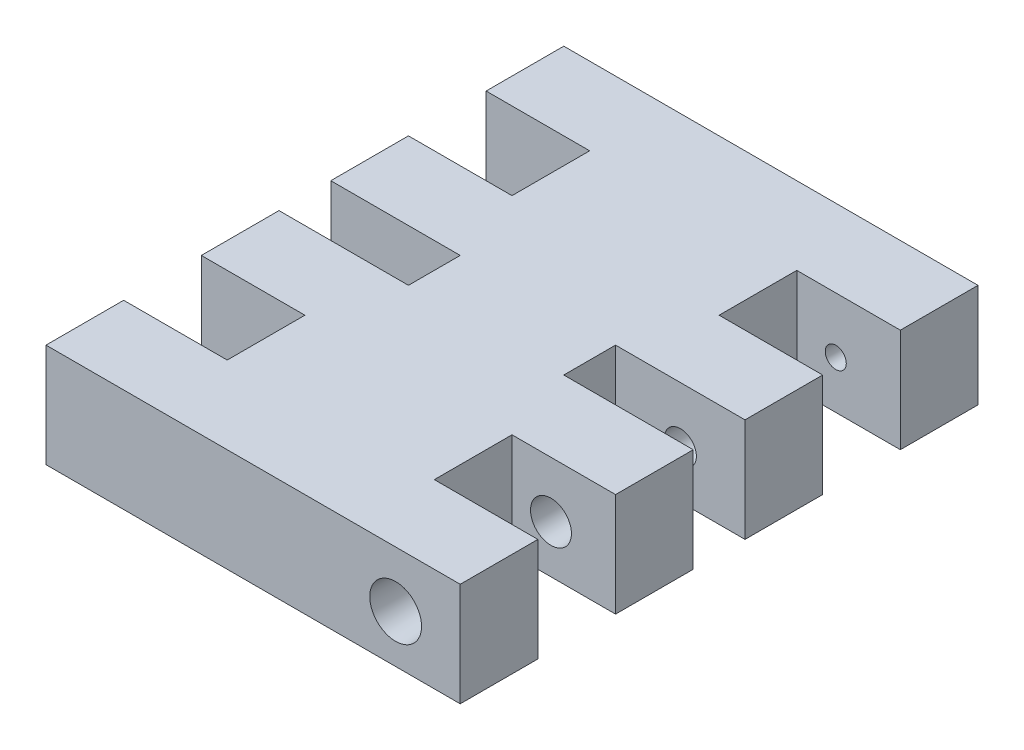
ISO-10303-21;
HEADER;
FILE_DESCRIPTION(('STEP AP214'),'2;1');
FILE_NAME('part.step','',(''),(''),'','','');
FILE_SCHEMA(('AUTOMOTIVE_DESIGN { 1 0 10303 214 1 1 1 1 }'));
ENDSEC;
DATA;
#1=APPLICATION_CONTEXT('core data for automotive mechanical design processes');
#2=APPLICATION_PROTOCOL_DEFINITION('international standard','automotive_design',2000,#1);
#3=PRODUCT_CONTEXT('',#1,'mechanical');
#4=PRODUCT('Part','Part','',(#3));
#5=PRODUCT_RELATED_PRODUCT_CATEGORY('part','',(#4));
#6=PRODUCT_DEFINITION_FORMATION('','',#4);
#7=PRODUCT_DEFINITION_CONTEXT('part definition',#1,'design');
#8=PRODUCT_DEFINITION('design','',#6,#7);
#9=PRODUCT_DEFINITION_SHAPE('','',#8);
#10=(LENGTH_UNIT() NAMED_UNIT(*) SI_UNIT(.MILLI.,.METRE.));
#11=(NAMED_UNIT(*) PLANE_ANGLE_UNIT() SI_UNIT($,.RADIAN.));
#12=(NAMED_UNIT(*) SI_UNIT($,.STERADIAN.) SOLID_ANGLE_UNIT());
#13=UNCERTAINTY_MEASURE_WITH_UNIT(LENGTH_MEASURE(1.E-05),#10,'distance_accuracy_value','');
#14=(GEOMETRIC_REPRESENTATION_CONTEXT(3) GLOBAL_UNCERTAINTY_ASSIGNED_CONTEXT((#13)) GLOBAL_UNIT_ASSIGNED_CONTEXT((#10,
#11,#12)) REPRESENTATION_CONTEXT('',''));
#15=CARTESIAN_POINT('',(0.,0.,0.));
#16=DIRECTION('',(0.,0.,1.));
#17=DIRECTION('',(1.,0.,0.));
#18=AXIS2_PLACEMENT_3D('',#15,#16,#17);
#19=CARTESIAN_POINT('',(-38.9074091112159,-10.,-58.0609960618839));
#20=DIRECTION('',(-1.,0.,0.));
#21=DIRECTION('',(0.,0.,1.));
#22=AXIS2_PLACEMENT_3D('',#19,#20,#21);
#23=PLANE('',#22);
#24=DIRECTION('',(0.,1.,0.));
#25=VECTOR('',#24,1.);
#26=CARTESIAN_POINT('',(-38.9074091112159,-10.,-43.0609960618839));
#27=LINE('',#26,#25);
#28=CARTESIAN_POINT('',(-38.9074091112159,-10.,-43.0609960618839));
#29=VERTEX_POINT('',#28);
#30=CARTESIAN_POINT('',(-38.9074091112159,10.,-43.0609960618839));
#31=VERTEX_POINT('',#30);
#32=EDGE_CURVE('E55',#29,#31,#27,.T.);
#33=ORIENTED_EDGE('',*,*,#32,.T.);
#34=DIRECTION('',(0.,0.,1.));
#35=VECTOR('',#34,1.);
#36=CARTESIAN_POINT('',(-38.9074091112159,10.,-58.0609960618839));
#37=LINE('',#36,#35);
#38=CARTESIAN_POINT('',(-38.9074091112159,10.,-58.0609960618839));
#39=VERTEX_POINT('',#38);
#40=EDGE_CURVE('E236',#39,#31,#37,.T.);
#41=ORIENTED_EDGE('',*,*,#40,.F.);
#42=DIRECTION('',(0.,1.,0.));
#43=VECTOR('',#42,1.);
#44=CARTESIAN_POINT('',(-38.9074091112159,-10.,-58.0609960618839));
#45=LINE('',#44,#43);
#46=CARTESIAN_POINT('',(-38.9074091112159,-10.,-58.0609960618839));
#47=VERTEX_POINT('',#46);
#48=EDGE_CURVE('E13',#47,#39,#45,.T.);
#49=ORIENTED_EDGE('',*,*,#48,.F.);
#50=DIRECTION('',(0.,0.,1.));
#51=VECTOR('',#50,1.);
#52=CARTESIAN_POINT('',(-38.9074091112159,-10.,-58.0609960618839));
#53=LINE('',#52,#51);
#54=EDGE_CURVE('E237',#47,#29,#53,.T.);
#55=ORIENTED_EDGE('',*,*,#54,.T.);
#56=EDGE_LOOP('',(#33,#41,#49,#55));
#57=FACE_BOUND('',#56,.T.);
#58=ADVANCED_FACE('F52',(#57),#23,.T.);
#59=CARTESIAN_POINT('',(41.0925908887841,-10.,-58.0609960618839));
#60=DIRECTION('',(0.,0.,-1.));
#61=DIRECTION('',(-1.,0.,0.));
#62=AXIS2_PLACEMENT_3D('',#59,#60,#61);
#63=PLANE('',#62);
#64=CARTESIAN_POINT('',(28.6203618893688,-0.784426918671755,-58.0609960618839));
#65=DIRECTION('',(0.,0.,1.));
#66=DIRECTION('',(1.,0.,0.));
#67=AXIS2_PLACEMENT_3D('',#64,#65,#66);
#68=CIRCLE('',#67,1.50792305082522);
#69=CARTESIAN_POINT('',(30.128284940194,-0.784426918671755,-58.0609960618839));
#70=VERTEX_POINT('',#69);
#71=EDGE_CURVE('E661',#70,#70,#68,.T.);
#72=ORIENTED_EDGE('',*,*,#71,.T.);
#73=EDGE_LOOP('',(#72));
#74=FACE_BOUND('',#73,.T.);
#75=ORIENTED_EDGE('',*,*,#48,.T.);
#76=DIRECTION('',(-1.,0.,0.));
#77=VECTOR('',#76,1.);
#78=CARTESIAN_POINT('',(41.0925908887841,10.,-58.0609960618839));
#79=LINE('',#78,#77);
#80=CARTESIAN_POINT('',(41.0925908887841,10.,-58.0609960618839));
#81=VERTEX_POINT('',#80);
#82=EDGE_CURVE('E254',#81,#39,#79,.T.);
#83=ORIENTED_EDGE('',*,*,#82,.F.);
#84=DIRECTION('',(0.,1.,0.));
#85=VECTOR('',#84,1.);
#86=CARTESIAN_POINT('',(41.0925908887841,-10.,-58.0609960618839));
#87=LINE('',#86,#85);
#88=CARTESIAN_POINT('',(41.0925908887841,-10.,-58.0609960618839));
#89=VERTEX_POINT('',#88);
#90=EDGE_CURVE('E60',#89,#81,#87,.T.);
#91=ORIENTED_EDGE('',*,*,#90,.F.);
#92=DIRECTION('',(-1.,0.,0.));
#93=VECTOR('',#92,1.);
#94=CARTESIAN_POINT('',(41.0925908887841,-10.,-58.0609960618839));
#95=LINE('',#94,#93);
#96=EDGE_CURVE('E242',#89,#47,#95,.T.);
#97=ORIENTED_EDGE('',*,*,#96,.T.);
#98=EDGE_LOOP('',(#75,#83,#91,#97));
#99=FACE_BOUND('',#98,.T.);
#100=ADVANCED_FACE('F563',(#74,#99),#63,.T.);
#101=CARTESIAN_POINT('',(41.0925908887841,-10.,-58.0609960618839));
#102=DIRECTION('',(1.,0.,0.));
#103=DIRECTION('',(0.,0.,-1.));
#104=AXIS2_PLACEMENT_3D('',#101,#102,#103);
#105=PLANE('',#104);
#106=ORIENTED_EDGE('',*,*,#90,.T.);
#107=DIRECTION('',(0.,0.,-1.));
#108=VECTOR('',#107,1.);
#109=CARTESIAN_POINT('',(41.0925908887841,10.,-58.0609960618839));
#110=LINE('',#109,#108);
#111=CARTESIAN_POINT('',(41.0925908887841,10.,-43.0609960618839));
#112=VERTEX_POINT('',#111);
#113=EDGE_CURVE('E332',#112,#81,#110,.T.);
#114=ORIENTED_EDGE('',*,*,#113,.F.);
#115=DIRECTION('',(0.,1.,0.));
#116=VECTOR('',#115,1.);
#117=CARTESIAN_POINT('',(41.0925908887841,-10.,-43.0609960618839));
#118=LINE('',#117,#116);
#119=CARTESIAN_POINT('',(41.0925908887841,-10.,-43.0609960618839));
#120=VERTEX_POINT('',#119);
#121=EDGE_CURVE('E414',#120,#112,#118,.T.);
#122=ORIENTED_EDGE('',*,*,#121,.F.);
#123=DIRECTION('',(0.,0.,-1.));
#124=VECTOR('',#123,1.);
#125=CARTESIAN_POINT('',(41.0925908887841,-10.,-58.0609960618839));
#126=LINE('',#125,#124);
#127=EDGE_CURVE('E410',#120,#89,#126,.T.);
#128=ORIENTED_EDGE('',*,*,#127,.T.);
#129=EDGE_LOOP('',(#106,#114,#122,#128));
#130=FACE_BOUND('',#129,.T.);
#131=ADVANCED_FACE('F561',(#130),#105,.T.);
#132=CARTESIAN_POINT('',(41.0925908887841,-10.,-43.0609960618839));
#133=DIRECTION('',(0.,0.,1.));
#134=DIRECTION('',(1.,0.,0.));
#135=AXIS2_PLACEMENT_3D('',#132,#133,#134);
#136=PLANE('',#135);
#137=CARTESIAN_POINT('',(28.6203618893688,-0.784426918671755,-43.0609960618839));
#138=DIRECTION('',(0.,0.,1.));
#139=DIRECTION('',(1.,0.,0.));
#140=AXIS2_PLACEMENT_3D('',#137,#138,#139);
#141=CIRCLE('',#140,2.03173459320144);
#142=CARTESIAN_POINT('',(30.6520964825703,-0.784426918671755,-43.0609960618839));
#143=VERTEX_POINT('',#142);
#144=EDGE_CURVE('E255',#143,#143,#141,.T.);
#145=ORIENTED_EDGE('',*,*,#144,.F.);
#146=EDGE_LOOP('',(#145));
#147=FACE_BOUND('',#146,.T.);
#148=ORIENTED_EDGE('',*,*,#121,.T.);
#149=DIRECTION('',(1.,0.,0.));
#150=VECTOR('',#149,1.);
#151=CARTESIAN_POINT('',(41.0925908887841,10.,-43.0609960618839));
#152=LINE('',#151,#150);
#153=CARTESIAN_POINT('',(21.0925908887841,10.,-43.0609960618839));
#154=VERTEX_POINT('',#153);
#155=EDGE_CURVE('E329',#154,#112,#152,.T.);
#156=ORIENTED_EDGE('',*,*,#155,.F.);
#157=DIRECTION('',(0.,1.,0.));
#158=VECTOR('',#157,1.);
#159=CARTESIAN_POINT('',(21.0925908887841,-10.,-43.0609960618839));
#160=LINE('',#159,#158);
#161=CARTESIAN_POINT('',(21.0925908887841,-10.,-43.0609960618839));
#162=VERTEX_POINT('',#161);
#163=EDGE_CURVE('E416',#162,#154,#160,.T.);
#164=ORIENTED_EDGE('',*,*,#163,.F.);
#165=DIRECTION('',(1.,0.,0.));
#166=VECTOR('',#165,1.);
#167=CARTESIAN_POINT('',(41.0925908887841,-10.,-43.0609960618839));
#168=LINE('',#167,#166);
#169=EDGE_CURVE('E407',#162,#120,#168,.T.);
#170=ORIENTED_EDGE('',*,*,#169,.T.);
#171=EDGE_LOOP('',(#148,#156,#164,#170));
#172=FACE_BOUND('',#171,.T.);
#173=ADVANCED_FACE('F557',(#147,#172),#136,.T.);
#174=CARTESIAN_POINT('',(21.0925908887841,-10.,-43.0609960618839));
#175=DIRECTION('',(1.,0.,0.));
#176=DIRECTION('',(0.,0.,-1.));
#177=AXIS2_PLACEMENT_3D('',#174,#175,#176);
#178=PLANE('',#177);
#179=ORIENTED_EDGE('',*,*,#163,.T.);
#180=DIRECTION('',(0.,0.,-1.));
#181=VECTOR('',#180,1.);
#182=CARTESIAN_POINT('',(21.0925908887841,10.,-43.0609960618839));
#183=LINE('',#182,#181);
#184=CARTESIAN_POINT('',(21.0925908887841,10.,-28.0609960618839));
#185=VERTEX_POINT('',#184);
#186=EDGE_CURVE('E326',#185,#154,#183,.T.);
#187=ORIENTED_EDGE('',*,*,#186,.F.);
#188=DIRECTION('',(0.,1.,0.));
#189=VECTOR('',#188,1.);
#190=CARTESIAN_POINT('',(21.0925908887841,-10.,-28.0609960618839));
#191=LINE('',#190,#189);
#192=CARTESIAN_POINT('',(21.0925908887841,-10.,-28.0609960618839));
#193=VERTEX_POINT('',#192);
#194=EDGE_CURVE('E418',#193,#185,#191,.T.);
#195=ORIENTED_EDGE('',*,*,#194,.F.);
#196=DIRECTION('',(0.,0.,-1.));
#197=VECTOR('',#196,1.);
#198=CARTESIAN_POINT('',(21.0925908887841,-10.,-43.0609960618839));
#199=LINE('',#198,#197);
#200=EDGE_CURVE('E404',#193,#162,#199,.T.);
#201=ORIENTED_EDGE('',*,*,#200,.T.);
#202=EDGE_LOOP('',(#179,#187,#195,#201));
#203=FACE_BOUND('',#202,.T.);
#204=ADVANCED_FACE('F555',(#203),#178,.T.);
#205=CARTESIAN_POINT('',(21.0925908887841,-10.,-28.0609960618839));
#206=DIRECTION('',(0.,0.,-1.));
#207=DIRECTION('',(-1.,0.,0.));
#208=AXIS2_PLACEMENT_3D('',#205,#206,#207);
#209=PLANE('',#208);
#210=CARTESIAN_POINT('',(28.6203618893688,-0.784426918671755,-28.0609960618839));
#211=DIRECTION('',(0.,0.,-1.));
#212=DIRECTION('',(-1.,0.,0.));
#213=AXIS2_PLACEMENT_3D('',#210,#211,#212);
#214=CIRCLE('',#213,2.55554613557766);
#215=CARTESIAN_POINT('',(26.0648157537912,-0.784426918671755,-28.0609960618839));
#216=VERTEX_POINT('',#215);
#217=EDGE_CURVE('E258',#216,#216,#214,.T.);
#218=ORIENTED_EDGE('',*,*,#217,.F.);
#219=EDGE_LOOP('',(#218));
#220=FACE_BOUND('',#219,.T.);
#221=ORIENTED_EDGE('',*,*,#194,.T.);
#222=DIRECTION('',(-1.,0.,0.));
#223=VECTOR('',#222,1.);
#224=CARTESIAN_POINT('',(21.0925908887841,10.,-28.0609960618839));
#225=LINE('',#224,#223);
#226=CARTESIAN_POINT('',(41.0925908887841,10.,-28.0609960618839));
#227=VERTEX_POINT('',#226);
#228=EDGE_CURVE('E323',#227,#185,#225,.T.);
#229=ORIENTED_EDGE('',*,*,#228,.F.);
#230=DIRECTION('',(0.,1.,0.));
#231=VECTOR('',#230,1.);
#232=CARTESIAN_POINT('',(41.0925908887841,-10.,-28.0609960618839));
#233=LINE('',#232,#231);
#234=CARTESIAN_POINT('',(41.0925908887841,-10.,-28.0609960618839));
#235=VERTEX_POINT('',#234);
#236=EDGE_CURVE('E420',#235,#227,#233,.T.);
#237=ORIENTED_EDGE('',*,*,#236,.F.);
#238=DIRECTION('',(-1.,0.,0.));
#239=VECTOR('',#238,1.);
#240=CARTESIAN_POINT('',(21.0925908887841,-10.,-28.0609960618839));
#241=LINE('',#240,#239);
#242=EDGE_CURVE('E401',#235,#193,#241,.T.);
#243=ORIENTED_EDGE('',*,*,#242,.T.);
#244=EDGE_LOOP('',(#221,#229,#237,#243));
#245=FACE_BOUND('',#244,.T.);
#246=ADVANCED_FACE('F550',(#220,#245),#209,.T.);
#247=CARTESIAN_POINT('',(41.0925908887841,-10.,-28.0609960618839));
#248=DIRECTION('',(1.,0.,0.));
#249=DIRECTION('',(0.,0.,-1.));
#250=AXIS2_PLACEMENT_3D('',#247,#248,#249);
#251=PLANE('',#250);
#252=ORIENTED_EDGE('',*,*,#236,.T.);
#253=DIRECTION('',(0.,0.,-1.));
#254=VECTOR('',#253,1.);
#255=CARTESIAN_POINT('',(41.0925908887841,10.,-28.0609960618839));
#256=LINE('',#255,#254);
#257=CARTESIAN_POINT('',(41.0925908887841,10.,-13.0609960618839));
#258=VERTEX_POINT('',#257);
#259=EDGE_CURVE('E320',#258,#227,#256,.T.);
#260=ORIENTED_EDGE('',*,*,#259,.F.);
#261=DIRECTION('',(0.,1.,0.));
#262=VECTOR('',#261,1.);
#263=CARTESIAN_POINT('',(41.0925908887841,-10.,-13.0609960618839));
#264=LINE('',#263,#262);
#265=CARTESIAN_POINT('',(41.0925908887841,-10.,-13.0609960618839));
#266=VERTEX_POINT('',#265);
#267=EDGE_CURVE('E422',#266,#258,#264,.T.);
#268=ORIENTED_EDGE('',*,*,#267,.F.);
#269=DIRECTION('',(0.,0.,-1.));
#270=VECTOR('',#269,1.);
#271=CARTESIAN_POINT('',(41.0925908887841,-10.,-28.0609960618839));
#272=LINE('',#271,#270);
#273=EDGE_CURVE('E398',#266,#235,#272,.T.);
#274=ORIENTED_EDGE('',*,*,#273,.T.);
#275=EDGE_LOOP('',(#252,#260,#268,#274));
#276=FACE_BOUND('',#275,.T.);
#277=ADVANCED_FACE('F545',(#276),#251,.T.);
#278=CARTESIAN_POINT('',(41.0925908887841,-10.,-13.0609960618839));
#279=DIRECTION('',(0.,0.,1.));
#280=DIRECTION('',(1.,0.,0.));
#281=AXIS2_PLACEMENT_3D('',#278,#279,#280);
#282=PLANE('',#281);
#283=CARTESIAN_POINT('',(28.6203618893688,-0.784426918671755,-13.0609960618839));
#284=DIRECTION('',(0.,0.,1.));
#285=DIRECTION('',(1.,0.,0.));
#286=AXIS2_PLACEMENT_3D('',#283,#284,#285);
#287=CIRCLE('',#286,3.07935767795387);
#288=CARTESIAN_POINT('',(31.6997195673227,-0.784426918671755,-13.0609960618839));
#289=VERTEX_POINT('',#288);
#290=EDGE_CURVE('E675',#289,#289,#287,.T.);
#291=ORIENTED_EDGE('',*,*,#290,.F.);
#292=EDGE_LOOP('',(#291));
#293=FACE_BOUND('',#292,.T.);
#294=ORIENTED_EDGE('',*,*,#267,.T.);
#295=DIRECTION('',(1.,0.,0.));
#296=VECTOR('',#295,1.);
#297=CARTESIAN_POINT('',(41.0925908887841,10.,-13.0609960618839));
#298=LINE('',#297,#296);
#299=CARTESIAN_POINT('',(16.0925908887841,10.,-13.0609960618839));
#300=VERTEX_POINT('',#299);
#301=EDGE_CURVE('E317',#300,#258,#298,.T.);
#302=ORIENTED_EDGE('',*,*,#301,.F.);
#303=DIRECTION('',(0.,1.,0.));
#304=VECTOR('',#303,1.);
#305=CARTESIAN_POINT('',(16.0925908887841,-10.,-13.0609960618839));
#306=LINE('',#305,#304);
#307=CARTESIAN_POINT('',(16.0925908887841,-10.,-13.0609960618839));
#308=VERTEX_POINT('',#307);
#309=EDGE_CURVE('E424',#308,#300,#306,.T.);
#310=ORIENTED_EDGE('',*,*,#309,.F.);
#311=DIRECTION('',(1.,0.,0.));
#312=VECTOR('',#311,1.);
#313=CARTESIAN_POINT('',(41.0925908887841,-10.,-13.0609960618839));
#314=LINE('',#313,#312);
#315=EDGE_CURVE('E395',#308,#266,#314,.T.);
#316=ORIENTED_EDGE('',*,*,#315,.T.);
#317=EDGE_LOOP('',(#294,#302,#310,#316));
#318=FACE_BOUND('',#317,.T.);
#319=ADVANCED_FACE('F543',(#293,#318),#282,.T.);
#320=CARTESIAN_POINT('',(16.0925908887841,-10.,-13.0609960618839));
#321=DIRECTION('',(1.,0.,0.));
#322=DIRECTION('',(0.,0.,-1.));
#323=AXIS2_PLACEMENT_3D('',#320,#321,#322);
#324=PLANE('',#323);
#325=ORIENTED_EDGE('',*,*,#309,.T.);
#326=DIRECTION('',(0.,0.,-1.));
#327=VECTOR('',#326,1.);
#328=CARTESIAN_POINT('',(16.0925908887841,10.,-13.0609960618839));
#329=LINE('',#328,#327);
#330=CARTESIAN_POINT('',(16.0925908887841,10.,-3.06099606188389));
#331=VERTEX_POINT('',#330);
#332=EDGE_CURVE('E314',#331,#300,#329,.T.);
#333=ORIENTED_EDGE('',*,*,#332,.F.);
#334=DIRECTION('',(0.,1.,0.));
#335=VECTOR('',#334,1.);
#336=CARTESIAN_POINT('',(16.0925908887841,-10.,-3.06099606188389));
#337=LINE('',#336,#335);
#338=CARTESIAN_POINT('',(16.0925908887841,-10.,-3.06099606188389));
#339=VERTEX_POINT('',#338);
#340=EDGE_CURVE('E426',#339,#331,#337,.T.);
#341=ORIENTED_EDGE('',*,*,#340,.F.);
#342=DIRECTION('',(0.,0.,-1.));
#343=VECTOR('',#342,1.);
#344=CARTESIAN_POINT('',(16.0925908887841,-10.,-13.0609960618839));
#345=LINE('',#344,#343);
#346=EDGE_CURVE('E392',#339,#308,#345,.T.);
#347=ORIENTED_EDGE('',*,*,#346,.T.);
#348=EDGE_LOOP('',(#325,#333,#341,#347));
#349=FACE_BOUND('',#348,.T.);
#350=ADVANCED_FACE('F538',(#349),#324,.T.);
#351=CARTESIAN_POINT('',(41.0925908887841,-10.,-3.06099606188388));
#352=DIRECTION('',(0.,0.,-1.));
#353=DIRECTION('',(-1.,0.,0.));
#354=AXIS2_PLACEMENT_3D('',#351,#352,#353);
#355=PLANE('',#354);
#356=CARTESIAN_POINT('',(28.6203618893688,-0.784426918671755,-3.06099606188388));
#357=DIRECTION('',(0.,0.,-1.));
#358=DIRECTION('',(-1.,0.,0.));
#359=AXIS2_PLACEMENT_3D('',#356,#357,#358);
#360=CIRCLE('',#359,3.42856537287135);
#361=CARTESIAN_POINT('',(25.1917965164975,-0.784426918671755,-3.06099606188388));
#362=VERTEX_POINT('',#361);
#363=EDGE_CURVE('E672',#362,#362,#360,.T.);
#364=ORIENTED_EDGE('',*,*,#363,.F.);
#365=EDGE_LOOP('',(#364));
#366=FACE_BOUND('',#365,.T.);
#367=ORIENTED_EDGE('',*,*,#340,.T.);
#368=DIRECTION('',(-1.,0.,0.));
#369=VECTOR('',#368,1.);
#370=CARTESIAN_POINT('',(41.0925908887841,10.,-3.06099606188388));
#371=LINE('',#370,#369);
#372=CARTESIAN_POINT('',(41.0925908887841,10.,-3.06099606188388));
#373=VERTEX_POINT('',#372);
#374=EDGE_CURVE('E311',#373,#331,#371,.T.);
#375=ORIENTED_EDGE('',*,*,#374,.F.);
#376=DIRECTION('',(0.,1.,0.));
#377=VECTOR('',#376,1.);
#378=CARTESIAN_POINT('',(41.0925908887841,-10.,-3.06099606188388));
#379=LINE('',#378,#377);
#380=CARTESIAN_POINT('',(41.0925908887841,-10.,-3.06099606188388));
#381=VERTEX_POINT('',#380);
#382=EDGE_CURVE('E428',#381,#373,#379,.T.);
#383=ORIENTED_EDGE('',*,*,#382,.F.);
#384=DIRECTION('',(-1.,0.,0.));
#385=VECTOR('',#384,1.);
#386=CARTESIAN_POINT('',(41.0925908887841,-10.,-3.06099606188388));
#387=LINE('',#386,#385);
#388=EDGE_CURVE('E389',#381,#339,#387,.T.);
#389=ORIENTED_EDGE('',*,*,#388,.T.);
#390=EDGE_LOOP('',(#367,#375,#383,#389));
#391=FACE_BOUND('',#390,.T.);
#392=ADVANCED_FACE('F533',(#366,#391),#355,.T.);
#393=CARTESIAN_POINT('',(41.0925908887841,-10.,11.9390039381161));
#394=DIRECTION('',(1.,0.,0.));
#395=DIRECTION('',(0.,0.,-1.));
#396=AXIS2_PLACEMENT_3D('',#393,#394,#395);
#397=PLANE('',#396);
#398=ORIENTED_EDGE('',*,*,#382,.T.);
#399=DIRECTION('',(0.,0.,-1.));
#400=VECTOR('',#399,1.);
#401=CARTESIAN_POINT('',(41.0925908887841,10.,11.9390039381161));
#402=LINE('',#401,#400);
#403=CARTESIAN_POINT('',(41.0925908887841,10.,11.9390039381161));
#404=VERTEX_POINT('',#403);
#405=EDGE_CURVE('E308',#404,#373,#402,.T.);
#406=ORIENTED_EDGE('',*,*,#405,.F.);
#407=DIRECTION('',(0.,1.,0.));
#408=VECTOR('',#407,1.);
#409=CARTESIAN_POINT('',(41.0925908887841,-10.,11.9390039381161));
#410=LINE('',#409,#408);
#411=CARTESIAN_POINT('',(41.0925908887841,-10.,11.9390039381161));
#412=VERTEX_POINT('',#411);
#413=EDGE_CURVE('E430',#412,#404,#410,.T.);
#414=ORIENTED_EDGE('',*,*,#413,.F.);
#415=DIRECTION('',(0.,0.,-1.));
#416=VECTOR('',#415,1.);
#417=CARTESIAN_POINT('',(41.0925908887841,-10.,11.9390039381161));
#418=LINE('',#417,#416);
#419=EDGE_CURVE('E386',#412,#381,#418,.T.);
#420=ORIENTED_EDGE('',*,*,#419,.T.);
#421=EDGE_LOOP('',(#398,#406,#414,#420));
#422=FACE_BOUND('',#421,.T.);
#423=ADVANCED_FACE('F531',(#422),#397,.T.);
#424=CARTESIAN_POINT('',(21.0925908887841,-10.,11.9390039381161));
#425=DIRECTION('',(0.,0.,1.));
#426=DIRECTION('',(1.,0.,0.));
#427=AXIS2_PLACEMENT_3D('',#424,#425,#426);
#428=PLANE('',#427);
#429=CARTESIAN_POINT('',(28.6203618893688,-0.784426918671755,11.9390039381161));
#430=DIRECTION('',(0.,0.,1.));
#431=DIRECTION('',(1.,0.,0.));
#432=AXIS2_PLACEMENT_3D('',#429,#430,#431);
#433=CIRCLE('',#432,3.95237691524757);
#434=CARTESIAN_POINT('',(32.5727388046164,-0.784426918671755,11.9390039381161));
#435=VERTEX_POINT('',#434);
#436=EDGE_CURVE('E665',#435,#435,#433,.T.);
#437=ORIENTED_EDGE('',*,*,#436,.F.);
#438=EDGE_LOOP('',(#437));
#439=FACE_BOUND('',#438,.T.);
#440=ORIENTED_EDGE('',*,*,#413,.T.);
#441=DIRECTION('',(1.,0.,0.));
#442=VECTOR('',#441,1.);
#443=CARTESIAN_POINT('',(21.0925908887841,10.,11.9390039381161));
#444=LINE('',#443,#442);
#445=CARTESIAN_POINT('',(21.0925908887841,10.,11.9390039381161));
#446=VERTEX_POINT('',#445);
#447=EDGE_CURVE('E305',#446,#404,#444,.T.);
#448=ORIENTED_EDGE('',*,*,#447,.F.);
#449=DIRECTION('',(0.,1.,0.));
#450=VECTOR('',#449,1.);
#451=CARTESIAN_POINT('',(21.0925908887841,-10.,11.9390039381161));
#452=LINE('',#451,#450);
#453=CARTESIAN_POINT('',(21.0925908887841,-10.,11.9390039381161));
#454=VERTEX_POINT('',#453);
#455=EDGE_CURVE('E432',#454,#446,#452,.T.);
#456=ORIENTED_EDGE('',*,*,#455,.F.);
#457=DIRECTION('',(1.,0.,0.));
#458=VECTOR('',#457,1.);
#459=CARTESIAN_POINT('',(21.0925908887841,-10.,11.9390039381161));
#460=LINE('',#459,#458);
#461=EDGE_CURVE('E383',#454,#412,#460,.T.);
#462=ORIENTED_EDGE('',*,*,#461,.T.);
#463=EDGE_LOOP('',(#440,#448,#456,#462));
#464=FACE_BOUND('',#463,.T.);
#465=ADVANCED_FACE('F526',(#439,#464),#428,.T.);
#466=CARTESIAN_POINT('',(21.0925908887841,-10.,26.9390039381161));
#467=DIRECTION('',(1.,0.,0.));
#468=DIRECTION('',(0.,0.,-1.));
#469=AXIS2_PLACEMENT_3D('',#466,#467,#468);
#470=PLANE('',#469);
#471=ORIENTED_EDGE('',*,*,#455,.T.);
#472=DIRECTION('',(0.,0.,-1.));
#473=VECTOR('',#472,1.);
#474=CARTESIAN_POINT('',(21.0925908887841,10.,26.9390039381161));
#475=LINE('',#474,#473);
#476=CARTESIAN_POINT('',(21.0925908887841,10.,26.9390039381161));
#477=VERTEX_POINT('',#476);
#478=EDGE_CURVE('E302',#477,#446,#475,.T.);
#479=ORIENTED_EDGE('',*,*,#478,.F.);
#480=DIRECTION('',(0.,1.,0.));
#481=VECTOR('',#480,1.);
#482=CARTESIAN_POINT('',(21.0925908887841,-10.,26.9390039381161));
#483=LINE('',#482,#481);
#484=CARTESIAN_POINT('',(21.0925908887841,-10.,26.9390039381161));
#485=VERTEX_POINT('',#484);
#486=EDGE_CURVE('E434',#485,#477,#483,.T.);
#487=ORIENTED_EDGE('',*,*,#486,.F.);
#488=DIRECTION('',(0.,0.,-1.));
#489=VECTOR('',#488,1.);
#490=CARTESIAN_POINT('',(21.0925908887841,-10.,26.9390039381161));
#491=LINE('',#490,#489);
#492=EDGE_CURVE('E380',#485,#454,#491,.T.);
#493=ORIENTED_EDGE('',*,*,#492,.T.);
#494=EDGE_LOOP('',(#471,#479,#487,#493));
#495=FACE_BOUND('',#494,.T.);
#496=ADVANCED_FACE('F521',(#495),#470,.T.);
#497=CARTESIAN_POINT('',(41.0925908887841,-10.,26.9390039381161));
#498=DIRECTION('',(0.,0.,-1.));
#499=DIRECTION('',(-1.,0.,0.));
#500=AXIS2_PLACEMENT_3D('',#497,#498,#499);
#501=PLANE('',#500);
#502=CARTESIAN_POINT('',(28.6203618893688,-0.784426918671755,26.9390039381161));
#503=DIRECTION('',(0.,0.,-1.));
#504=DIRECTION('',(-1.,0.,0.));
#505=AXIS2_PLACEMENT_3D('',#502,#503,#504);
#506=CIRCLE('',#505,4.47618845762379);
#507=CARTESIAN_POINT('',(24.144173431745,-0.784426918671755,26.9390039381161));
#508=VERTEX_POINT('',#507);
#509=EDGE_CURVE('E662',#508,#508,#506,.T.);
#510=ORIENTED_EDGE('',*,*,#509,.F.);
#511=EDGE_LOOP('',(#510));
#512=FACE_BOUND('',#511,.T.);
#513=ORIENTED_EDGE('',*,*,#486,.T.);
#514=DIRECTION('',(-1.,0.,0.));
#515=VECTOR('',#514,1.);
#516=CARTESIAN_POINT('',(41.0925908887841,10.,26.9390039381161));
#517=LINE('',#516,#515);
#518=CARTESIAN_POINT('',(41.0925908887841,10.,26.9390039381161));
#519=VERTEX_POINT('',#518);
#520=EDGE_CURVE('E299',#519,#477,#517,.T.);
#521=ORIENTED_EDGE('',*,*,#520,.F.);
#522=DIRECTION('',(0.,1.,0.));
#523=VECTOR('',#522,1.);
#524=CARTESIAN_POINT('',(41.0925908887841,-10.,26.9390039381161));
#525=LINE('',#524,#523);
#526=CARTESIAN_POINT('',(41.0925908887841,-10.,26.9390039381161));
#527=VERTEX_POINT('',#526);
#528=EDGE_CURVE('E436',#527,#519,#525,.T.);
#529=ORIENTED_EDGE('',*,*,#528,.F.);
#530=DIRECTION('',(-1.,0.,0.));
#531=VECTOR('',#530,1.);
#532=CARTESIAN_POINT('',(41.0925908887841,-10.,26.9390039381161));
#533=LINE('',#532,#531);
#534=EDGE_CURVE('E377',#527,#485,#533,.T.);
#535=ORIENTED_EDGE('',*,*,#534,.T.);
#536=EDGE_LOOP('',(#513,#521,#529,#535));
#537=FACE_BOUND('',#536,.T.);
#538=ADVANCED_FACE('F519',(#512,#537),#501,.T.);
#539=CARTESIAN_POINT('',(41.0925908887841,-10.,41.9390039381161));
#540=DIRECTION('',(1.,0.,0.));
#541=DIRECTION('',(0.,0.,-1.));
#542=AXIS2_PLACEMENT_3D('',#539,#540,#541);
#543=PLANE('',#542);
#544=ORIENTED_EDGE('',*,*,#528,.T.);
#545=DIRECTION('',(0.,0.,-1.));
#546=VECTOR('',#545,1.);
#547=CARTESIAN_POINT('',(41.0925908887841,10.,41.9390039381161));
#548=LINE('',#547,#546);
#549=CARTESIAN_POINT('',(41.0925908887841,10.,41.9390039381161));
#550=VERTEX_POINT('',#549);
#551=EDGE_CURVE('E296',#550,#519,#548,.T.);
#552=ORIENTED_EDGE('',*,*,#551,.F.);
#553=DIRECTION('',(0.,1.,0.));
#554=VECTOR('',#553,1.);
#555=CARTESIAN_POINT('',(41.0925908887841,-10.,41.9390039381161));
#556=LINE('',#555,#554);
#557=CARTESIAN_POINT('',(41.0925908887841,-10.,41.9390039381161));
#558=VERTEX_POINT('',#557);
#559=EDGE_CURVE('E438',#558,#550,#556,.T.);
#560=ORIENTED_EDGE('',*,*,#559,.F.);
#561=DIRECTION('',(0.,0.,-1.));
#562=VECTOR('',#561,1.);
#563=CARTESIAN_POINT('',(41.0925908887841,-10.,41.9390039381161));
#564=LINE('',#563,#562);
#565=EDGE_CURVE('E374',#558,#527,#564,.T.);
#566=ORIENTED_EDGE('',*,*,#565,.T.);
#567=EDGE_LOOP('',(#544,#552,#560,#566));
#568=FACE_BOUND('',#567,.T.);
#569=ADVANCED_FACE('F514',(#568),#543,.T.);
#570=CARTESIAN_POINT('',(41.0925908887841,-10.,41.9390039381161));
#571=DIRECTION('',(0.,0.,1.));
#572=DIRECTION('',(1.,0.,0.));
#573=AXIS2_PLACEMENT_3D('',#570,#571,#572);
#574=PLANE('',#573);
#575=CARTESIAN_POINT('',(28.6203618893688,-0.784426918671755,41.9390039381161));
#576=DIRECTION('',(0.,0.,1.));
#577=DIRECTION('',(1.,0.,0.));
#578=AXIS2_PLACEMENT_3D('',#575,#576,#577);
#579=CIRCLE('',#578,5.);
#580=CARTESIAN_POINT('',(33.6203618893688,-0.784426918671755,41.9390039381161));
#581=VERTEX_POINT('',#580);
#582=EDGE_CURVE('E663',#581,#581,#579,.T.);
#583=ORIENTED_EDGE('',*,*,#582,.F.);
#584=EDGE_LOOP('',(#583));
#585=FACE_BOUND('',#584,.T.);
#586=ORIENTED_EDGE('',*,*,#559,.T.);
#587=DIRECTION('',(1.,0.,0.));
#588=VECTOR('',#587,1.);
#589=CARTESIAN_POINT('',(41.0925908887841,10.,41.9390039381161));
#590=LINE('',#589,#588);
#591=CARTESIAN_POINT('',(-38.9074091112159,10.,41.9390039381161));
#592=VERTEX_POINT('',#591);
#593=EDGE_CURVE('E293',#592,#550,#590,.T.);
#594=ORIENTED_EDGE('',*,*,#593,.F.);
#595=DIRECTION('',(0.,1.,0.));
#596=VECTOR('',#595,1.);
#597=CARTESIAN_POINT('',(-38.9074091112159,-10.,41.9390039381161));
#598=LINE('',#597,#596);
#599=CARTESIAN_POINT('',(-38.9074091112159,-10.,41.9390039381161));
#600=VERTEX_POINT('',#599);
#601=EDGE_CURVE('E440',#600,#592,#598,.T.);
#602=ORIENTED_EDGE('',*,*,#601,.F.);
#603=DIRECTION('',(1.,0.,0.));
#604=VECTOR('',#603,1.);
#605=CARTESIAN_POINT('',(41.0925908887841,-10.,41.9390039381161));
#606=LINE('',#605,#604);
#607=EDGE_CURVE('E371',#600,#558,#606,.T.);
#608=ORIENTED_EDGE('',*,*,#607,.T.);
#609=EDGE_LOOP('',(#586,#594,#602,#608));
#610=FACE_BOUND('',#609,.T.);
#611=ADVANCED_FACE('F509',(#585,#610),#574,.T.);
#612=CARTESIAN_POINT('',(-38.9074091112159,-10.,41.9390039381161));
#613=DIRECTION('',(-1.,0.,0.));
#614=DIRECTION('',(0.,0.,1.));
#615=AXIS2_PLACEMENT_3D('',#612,#613,#614);
#616=PLANE('',#615);
#617=ORIENTED_EDGE('',*,*,#601,.T.);
#618=DIRECTION('',(0.,0.,1.));
#619=VECTOR('',#618,1.);
#620=CARTESIAN_POINT('',(-38.9074091112159,10.,41.9390039381161));
#621=LINE('',#620,#619);
#622=CARTESIAN_POINT('',(-38.9074091112159,10.,26.9390039381161));
#623=VERTEX_POINT('',#622);
#624=EDGE_CURVE('E290',#623,#592,#621,.T.);
#625=ORIENTED_EDGE('',*,*,#624,.F.);
#626=DIRECTION('',(0.,1.,0.));
#627=VECTOR('',#626,1.);
#628=CARTESIAN_POINT('',(-38.9074091112159,-10.,26.9390039381161));
#629=LINE('',#628,#627);
#630=CARTESIAN_POINT('',(-38.9074091112159,-10.,26.9390039381161));
#631=VERTEX_POINT('',#630);
#632=EDGE_CURVE('E442',#631,#623,#629,.T.);
#633=ORIENTED_EDGE('',*,*,#632,.F.);
#634=DIRECTION('',(0.,0.,1.));
#635=VECTOR('',#634,1.);
#636=CARTESIAN_POINT('',(-38.9074091112159,-10.,41.9390039381161));
#637=LINE('',#636,#635);
#638=EDGE_CURVE('E368',#631,#600,#637,.T.);
#639=ORIENTED_EDGE('',*,*,#638,.T.);
#640=EDGE_LOOP('',(#617,#625,#633,#639));
#641=FACE_BOUND('',#640,.T.);
#642=ADVANCED_FACE('F507',(#641),#616,.T.);
#643=CARTESIAN_POINT('',(-38.9074091112159,-10.,26.9390039381161));
#644=DIRECTION('',(0.,0.,-1.));
#645=DIRECTION('',(-1.,0.,0.));
#646=AXIS2_PLACEMENT_3D('',#643,#644,#645);
#647=PLANE('',#646);
#648=ORIENTED_EDGE('',*,*,#632,.T.);
#649=DIRECTION('',(-1.,0.,0.));
#650=VECTOR('',#649,1.);
#651=CARTESIAN_POINT('',(-38.9074091112159,10.,26.9390039381161));
#652=LINE('',#651,#650);
#653=CARTESIAN_POINT('',(-18.9074091112159,10.,26.9390039381161));
#654=VERTEX_POINT('',#653);
#655=EDGE_CURVE('E287',#654,#623,#652,.T.);
#656=ORIENTED_EDGE('',*,*,#655,.F.);
#657=DIRECTION('',(0.,1.,0.));
#658=VECTOR('',#657,1.);
#659=CARTESIAN_POINT('',(-18.9074091112159,-10.,26.9390039381161));
#660=LINE('',#659,#658);
#661=CARTESIAN_POINT('',(-18.9074091112159,-10.,26.9390039381161));
#662=VERTEX_POINT('',#661);
#663=EDGE_CURVE('E444',#662,#654,#660,.T.);
#664=ORIENTED_EDGE('',*,*,#663,.F.);
#665=DIRECTION('',(-1.,0.,0.));
#666=VECTOR('',#665,1.);
#667=CARTESIAN_POINT('',(-38.9074091112159,-10.,26.9390039381161));
#668=LINE('',#667,#666);
#669=EDGE_CURVE('E365',#662,#631,#668,.T.);
#670=ORIENTED_EDGE('',*,*,#669,.T.);
#671=EDGE_LOOP('',(#648,#656,#664,#670));
#672=FACE_BOUND('',#671,.T.);
#673=ADVANCED_FACE('F502',(#672),#647,.T.);
#674=CARTESIAN_POINT('',(-18.9074091112159,-10.,26.9390039381161));
#675=DIRECTION('',(-1.,0.,0.));
#676=DIRECTION('',(0.,0.,1.));
#677=AXIS2_PLACEMENT_3D('',#674,#675,#676);
#678=PLANE('',#677);
#679=ORIENTED_EDGE('',*,*,#663,.T.);
#680=DIRECTION('',(0.,0.,1.));
#681=VECTOR('',#680,1.);
#682=CARTESIAN_POINT('',(-18.9074091112159,10.,26.9390039381161));
#683=LINE('',#682,#681);
#684=CARTESIAN_POINT('',(-18.9074091112159,10.,11.9390039381161));
#685=VERTEX_POINT('',#684);
#686=EDGE_CURVE('E284',#685,#654,#683,.T.);
#687=ORIENTED_EDGE('',*,*,#686,.F.);
#688=DIRECTION('',(0.,1.,0.));
#689=VECTOR('',#688,1.);
#690=CARTESIAN_POINT('',(-18.9074091112159,-10.,11.9390039381161));
#691=LINE('',#690,#689);
#692=CARTESIAN_POINT('',(-18.9074091112159,-10.,11.9390039381161));
#693=VERTEX_POINT('',#692);
#694=EDGE_CURVE('E446',#693,#685,#691,.T.);
#695=ORIENTED_EDGE('',*,*,#694,.F.);
#696=DIRECTION('',(0.,0.,1.));
#697=VECTOR('',#696,1.);
#698=CARTESIAN_POINT('',(-18.9074091112159,-10.,26.9390039381161));
#699=LINE('',#698,#697);
#700=EDGE_CURVE('E362',#693,#662,#699,.T.);
#701=ORIENTED_EDGE('',*,*,#700,.T.);
#702=EDGE_LOOP('',(#679,#687,#695,#701));
#703=FACE_BOUND('',#702,.T.);
#704=ADVANCED_FACE('F497',(#703),#678,.T.);
#705=CARTESIAN_POINT('',(-18.9074091112159,-10.,11.9390039381161));
#706=DIRECTION('',(0.,0.,1.));
#707=DIRECTION('',(1.,0.,0.));
#708=AXIS2_PLACEMENT_3D('',#705,#706,#707);
#709=PLANE('',#708);
#710=ORIENTED_EDGE('',*,*,#694,.T.);
#711=DIRECTION('',(1.,0.,0.));
#712=VECTOR('',#711,1.);
#713=CARTESIAN_POINT('',(-18.9074091112159,10.,11.9390039381161));
#714=LINE('',#713,#712);
#715=CARTESIAN_POINT('',(-38.9074091112158,10.,11.9390039381161));
#716=VERTEX_POINT('',#715);
#717=EDGE_CURVE('E281',#716,#685,#714,.T.);
#718=ORIENTED_EDGE('',*,*,#717,.F.);
#719=DIRECTION('',(0.,1.,0.));
#720=VECTOR('',#719,1.);
#721=CARTESIAN_POINT('',(-38.9074091112158,-10.,11.9390039381161));
#722=LINE('',#721,#720);
#723=CARTESIAN_POINT('',(-38.9074091112158,-10.,11.9390039381161));
#724=VERTEX_POINT('',#723);
#725=EDGE_CURVE('E448',#724,#716,#722,.T.);
#726=ORIENTED_EDGE('',*,*,#725,.F.);
#727=DIRECTION('',(1.,0.,0.));
#728=VECTOR('',#727,1.);
#729=CARTESIAN_POINT('',(-18.9074091112159,-10.,11.9390039381161));
#730=LINE('',#729,#728);
#731=EDGE_CURVE('E359',#724,#693,#730,.T.);
#732=ORIENTED_EDGE('',*,*,#731,.T.);
#733=EDGE_LOOP('',(#710,#718,#726,#732));
#734=FACE_BOUND('',#733,.T.);
#735=ADVANCED_FACE('F495',(#734),#709,.T.);
#736=CARTESIAN_POINT('',(-38.9074091112158,-10.,11.9390039381161));
#737=DIRECTION('',(-1.,0.,0.));
#738=DIRECTION('',(0.,0.,1.));
#739=AXIS2_PLACEMENT_3D('',#736,#737,#738);
#740=PLANE('',#739);
#741=ORIENTED_EDGE('',*,*,#725,.T.);
#742=DIRECTION('',(0.,0.,1.));
#743=VECTOR('',#742,1.);
#744=CARTESIAN_POINT('',(-38.9074091112158,10.,11.9390039381161));
#745=LINE('',#744,#743);
#746=CARTESIAN_POINT('',(-38.9074091112159,10.,-3.06099606188389));
#747=VERTEX_POINT('',#746);
#748=EDGE_CURVE('E278',#747,#716,#745,.T.);
#749=ORIENTED_EDGE('',*,*,#748,.F.);
#750=DIRECTION('',(0.,1.,0.));
#751=VECTOR('',#750,1.);
#752=CARTESIAN_POINT('',(-38.9074091112159,-10.,-3.06099606188389));
#753=LINE('',#752,#751);
#754=CARTESIAN_POINT('',(-38.9074091112159,-10.,-3.06099606188389));
#755=VERTEX_POINT('',#754);
#756=EDGE_CURVE('E450',#755,#747,#753,.T.);
#757=ORIENTED_EDGE('',*,*,#756,.F.);
#758=DIRECTION('',(0.,0.,1.));
#759=VECTOR('',#758,1.);
#760=CARTESIAN_POINT('',(-38.9074091112158,-10.,11.9390039381161));
#761=LINE('',#760,#759);
#762=EDGE_CURVE('E356',#755,#724,#761,.T.);
#763=ORIENTED_EDGE('',*,*,#762,.T.);
#764=EDGE_LOOP('',(#741,#749,#757,#763));
#765=FACE_BOUND('',#764,.T.);
#766=ADVANCED_FACE('F490',(#765),#740,.T.);
#767=CARTESIAN_POINT('',(-38.9074091112159,-10.,-3.06099606188389));
#768=DIRECTION('',(0.,0.,-1.));
#769=DIRECTION('',(-1.,0.,0.));
#770=AXIS2_PLACEMENT_3D('',#767,#768,#769);
#771=PLANE('',#770);
#772=ORIENTED_EDGE('',*,*,#756,.T.);
#773=DIRECTION('',(-1.,0.,0.));
#774=VECTOR('',#773,1.);
#775=CARTESIAN_POINT('',(-38.9074091112159,10.,-3.06099606188389));
#776=LINE('',#775,#774);
#777=CARTESIAN_POINT('',(-13.9074091112159,10.,-3.06099606188389));
#778=VERTEX_POINT('',#777);
#779=EDGE_CURVE('E275',#778,#747,#776,.T.);
#780=ORIENTED_EDGE('',*,*,#779,.F.);
#781=DIRECTION('',(0.,1.,0.));
#782=VECTOR('',#781,1.);
#783=CARTESIAN_POINT('',(-13.9074091112159,-10.,-3.06099606188389));
#784=LINE('',#783,#782);
#785=CARTESIAN_POINT('',(-13.9074091112159,-10.,-3.06099606188389));
#786=VERTEX_POINT('',#785);
#787=EDGE_CURVE('E452',#786,#778,#784,.T.);
#788=ORIENTED_EDGE('',*,*,#787,.F.);
#789=DIRECTION('',(-1.,0.,0.));
#790=VECTOR('',#789,1.);
#791=CARTESIAN_POINT('',(-38.9074091112159,-10.,-3.06099606188389));
#792=LINE('',#791,#790);
#793=EDGE_CURVE('E353',#786,#755,#792,.T.);
#794=ORIENTED_EDGE('',*,*,#793,.T.);
#795=EDGE_LOOP('',(#772,#780,#788,#794));
#796=FACE_BOUND('',#795,.T.);
#797=ADVANCED_FACE('F485',(#796),#771,.T.);
#798=CARTESIAN_POINT('',(-13.9074091112159,-10.,-13.0609960618839));
#799=DIRECTION('',(-1.,0.,0.));
#800=DIRECTION('',(0.,0.,1.));
#801=AXIS2_PLACEMENT_3D('',#798,#799,#800);
#802=PLANE('',#801);
#803=ORIENTED_EDGE('',*,*,#787,.T.);
#804=DIRECTION('',(0.,0.,1.));
#805=VECTOR('',#804,1.);
#806=CARTESIAN_POINT('',(-13.9074091112159,10.,-13.0609960618839));
#807=LINE('',#806,#805);
#808=CARTESIAN_POINT('',(-13.9074091112159,10.,-13.0609960618839));
#809=VERTEX_POINT('',#808);
#810=EDGE_CURVE('E272',#809,#778,#807,.T.);
#811=ORIENTED_EDGE('',*,*,#810,.F.);
#812=DIRECTION('',(0.,1.,0.));
#813=VECTOR('',#812,1.);
#814=CARTESIAN_POINT('',(-13.9074091112159,-10.,-13.0609960618839));
#815=LINE('',#814,#813);
#816=CARTESIAN_POINT('',(-13.9074091112159,-10.,-13.0609960618839));
#817=VERTEX_POINT('',#816);
#818=EDGE_CURVE('E454',#817,#809,#815,.T.);
#819=ORIENTED_EDGE('',*,*,#818,.F.);
#820=DIRECTION('',(0.,0.,1.));
#821=VECTOR('',#820,1.);
#822=CARTESIAN_POINT('',(-13.9074091112159,-10.,-13.0609960618839));
#823=LINE('',#822,#821);
#824=EDGE_CURVE('E350',#817,#786,#823,.T.);
#825=ORIENTED_EDGE('',*,*,#824,.T.);
#826=EDGE_LOOP('',(#803,#811,#819,#825));
#827=FACE_BOUND('',#826,.T.);
#828=ADVANCED_FACE('F483',(#827),#802,.T.);
#829=CARTESIAN_POINT('',(-38.9074091112159,-10.,-13.0609960618839));
#830=DIRECTION('',(0.,0.,1.));
#831=DIRECTION('',(1.,0.,0.));
#832=AXIS2_PLACEMENT_3D('',#829,#830,#831);
#833=PLANE('',#832);
#834=ORIENTED_EDGE('',*,*,#818,.T.);
#835=DIRECTION('',(1.,0.,0.));
#836=VECTOR('',#835,1.);
#837=CARTESIAN_POINT('',(-38.9074091112159,10.,-13.0609960618839));
#838=LINE('',#837,#836);
#839=CARTESIAN_POINT('',(-38.9074091112159,10.,-13.0609960618839));
#840=VERTEX_POINT('',#839);
#841=EDGE_CURVE('E269',#840,#809,#838,.T.);
#842=ORIENTED_EDGE('',*,*,#841,.F.);
#843=DIRECTION('',(0.,1.,0.));
#844=VECTOR('',#843,1.);
#845=CARTESIAN_POINT('',(-38.9074091112159,-10.,-13.0609960618839));
#846=LINE('',#845,#844);
#847=CARTESIAN_POINT('',(-38.9074091112159,-10.,-13.0609960618839));
#848=VERTEX_POINT('',#847);
#849=EDGE_CURVE('E456',#848,#840,#846,.T.);
#850=ORIENTED_EDGE('',*,*,#849,.F.);
#851=DIRECTION('',(1.,0.,0.));
#852=VECTOR('',#851,1.);
#853=CARTESIAN_POINT('',(-38.9074091112159,-10.,-13.0609960618839));
#854=LINE('',#853,#852);
#855=EDGE_CURVE('E347',#848,#817,#854,.T.);
#856=ORIENTED_EDGE('',*,*,#855,.T.);
#857=EDGE_LOOP('',(#834,#842,#850,#856));
#858=FACE_BOUND('',#857,.T.);
#859=ADVANCED_FACE('F478',(#858),#833,.T.);
#860=CARTESIAN_POINT('',(-38.9074091112158,-10.,-28.0609960618839));
#861=DIRECTION('',(-1.,0.,0.));
#862=DIRECTION('',(0.,0.,1.));
#863=AXIS2_PLACEMENT_3D('',#860,#861,#862);
#864=PLANE('',#863);
#865=ORIENTED_EDGE('',*,*,#849,.T.);
#866=DIRECTION('',(0.,0.,1.));
#867=VECTOR('',#866,1.);
#868=CARTESIAN_POINT('',(-38.9074091112158,10.,-28.0609960618839));
#869=LINE('',#868,#867);
#870=CARTESIAN_POINT('',(-38.9074091112158,10.,-28.0609960618839));
#871=VERTEX_POINT('',#870);
#872=EDGE_CURVE('E266',#871,#840,#869,.T.);
#873=ORIENTED_EDGE('',*,*,#872,.F.);
#874=DIRECTION('',(0.,1.,0.));
#875=VECTOR('',#874,1.);
#876=CARTESIAN_POINT('',(-38.9074091112158,-10.,-28.0609960618839));
#877=LINE('',#876,#875);
#878=CARTESIAN_POINT('',(-38.9074091112158,-10.,-28.0609960618839));
#879=VERTEX_POINT('',#878);
#880=EDGE_CURVE('E458',#879,#871,#877,.T.);
#881=ORIENTED_EDGE('',*,*,#880,.F.);
#882=DIRECTION('',(0.,0.,1.));
#883=VECTOR('',#882,1.);
#884=CARTESIAN_POINT('',(-38.9074091112158,-10.,-28.0609960618839));
#885=LINE('',#884,#883);
#886=EDGE_CURVE('E344',#879,#848,#885,.T.);
#887=ORIENTED_EDGE('',*,*,#886,.T.);
#888=EDGE_LOOP('',(#865,#873,#881,#887));
#889=FACE_BOUND('',#888,.T.);
#890=ADVANCED_FACE('F471',(#889),#864,.T.);
#891=CARTESIAN_POINT('',(-18.9074091112159,-10.,-28.0609960618839));
#892=DIRECTION('',(0.,0.,-1.));
#893=DIRECTION('',(-1.,0.,0.));
#894=AXIS2_PLACEMENT_3D('',#891,#892,#893);
#895=PLANE('',#894);
#896=ORIENTED_EDGE('',*,*,#880,.T.);
#897=DIRECTION('',(-1.,0.,0.));
#898=VECTOR('',#897,1.);
#899=CARTESIAN_POINT('',(-18.9074091112159,10.,-28.0609960618839));
#900=LINE('',#899,#898);
#901=CARTESIAN_POINT('',(-18.9074091112159,10.,-28.0609960618839));
#902=VERTEX_POINT('',#901);
#903=EDGE_CURVE('E263',#902,#871,#900,.T.);
#904=ORIENTED_EDGE('',*,*,#903,.F.);
#905=DIRECTION('',(0.,1.,0.));
#906=VECTOR('',#905,1.);
#907=CARTESIAN_POINT('',(-18.9074091112159,-10.,-28.0609960618839));
#908=LINE('',#907,#906);
#909=CARTESIAN_POINT('',(-18.9074091112159,-10.,-28.0609960618839));
#910=VERTEX_POINT('',#909);
#911=EDGE_CURVE('E460',#910,#902,#908,.T.);
#912=ORIENTED_EDGE('',*,*,#911,.F.);
#913=DIRECTION('',(-1.,0.,0.));
#914=VECTOR('',#913,1.);
#915=CARTESIAN_POINT('',(-18.9074091112159,-10.,-28.0609960618839));
#916=LINE('',#915,#914);
#917=EDGE_CURVE('E341',#910,#879,#916,.T.);
#918=ORIENTED_EDGE('',*,*,#917,.T.);
#919=EDGE_LOOP('',(#896,#904,#912,#918));
#920=FACE_BOUND('',#919,.T.);
#921=ADVANCED_FACE('F468',(#920),#895,.T.);
#922=CARTESIAN_POINT('',(-18.9074091112159,-10.,-43.0609960618839));
#923=DIRECTION('',(-1.,0.,0.));
#924=DIRECTION('',(0.,0.,1.));
#925=AXIS2_PLACEMENT_3D('',#922,#923,#924);
#926=PLANE('',#925);
#927=ORIENTED_EDGE('',*,*,#911,.T.);
#928=DIRECTION('',(0.,0.,1.));
#929=VECTOR('',#928,1.);
#930=CARTESIAN_POINT('',(-18.9074091112159,10.,-43.0609960618839));
#931=LINE('',#930,#929);
#932=CARTESIAN_POINT('',(-18.9074091112159,10.,-43.0609960618839));
#933=VERTEX_POINT('',#932);
#934=EDGE_CURVE('E249',#933,#902,#931,.T.);
#935=ORIENTED_EDGE('',*,*,#934,.F.);
#936=DIRECTION('',(0.,1.,0.));
#937=VECTOR('',#936,1.);
#938=CARTESIAN_POINT('',(-18.9074091112159,-10.,-43.0609960618839));
#939=LINE('',#938,#937);
#940=CARTESIAN_POINT('',(-18.9074091112159,-10.,-43.0609960618839));
#941=VERTEX_POINT('',#940);
#942=EDGE_CURVE('E241',#941,#933,#939,.T.);
#943=ORIENTED_EDGE('',*,*,#942,.F.);
#944=DIRECTION('',(0.,0.,1.));
#945=VECTOR('',#944,1.);
#946=CARTESIAN_POINT('',(-18.9074091112159,-10.,-43.0609960618839));
#947=LINE('',#946,#945);
#948=EDGE_CURVE('E338',#941,#910,#947,.T.);
#949=ORIENTED_EDGE('',*,*,#948,.T.);
#950=EDGE_LOOP('',(#927,#935,#943,#949));
#951=FACE_BOUND('',#950,.T.);
#952=ADVANCED_FACE('F462',(#951),#926,.T.);
#953=CARTESIAN_POINT('',(-38.9074091112159,-10.,-43.0609960618839));
#954=DIRECTION('',(0.,0.,1.));
#955=DIRECTION('',(1.,0.,0.));
#956=AXIS2_PLACEMENT_3D('',#953,#954,#955);
#957=PLANE('',#956);
#958=ORIENTED_EDGE('',*,*,#942,.T.);
#959=DIRECTION('',(1.,0.,0.));
#960=VECTOR('',#959,1.);
#961=CARTESIAN_POINT('',(-38.9074091112159,10.,-43.0609960618839));
#962=LINE('',#961,#960);
#963=EDGE_CURVE('E244',#31,#933,#962,.T.);
#964=ORIENTED_EDGE('',*,*,#963,.F.);
#965=ORIENTED_EDGE('',*,*,#32,.F.);
#966=DIRECTION('',(1.,0.,0.));
#967=VECTOR('',#966,1.);
#968=CARTESIAN_POINT('',(-38.9074091112159,-10.,-43.0609960618839));
#969=LINE('',#968,#967);
#970=EDGE_CURVE('E336',#29,#941,#969,.T.);
#971=ORIENTED_EDGE('',*,*,#970,.T.);
#972=EDGE_LOOP('',(#958,#964,#965,#971));
#973=FACE_BOUND('',#972,.T.);
#974=ADVANCED_FACE('F245',(#973),#957,.T.);
#975=CARTESIAN_POINT('',(0.,-10.,0.));
#976=DIRECTION('',(0.,1.,0.));
#977=DIRECTION('',(0.,0.,1.));
#978=AXIS2_PLACEMENT_3D('',#975,#976,#977);
#979=PLANE('',#978);
#980=ORIENTED_EDGE('',*,*,#54,.F.);
#981=ORIENTED_EDGE('',*,*,#96,.F.);
#982=ORIENTED_EDGE('',*,*,#127,.F.);
#983=ORIENTED_EDGE('',*,*,#169,.F.);
#984=ORIENTED_EDGE('',*,*,#200,.F.);
#985=ORIENTED_EDGE('',*,*,#242,.F.);
#986=ORIENTED_EDGE('',*,*,#273,.F.);
#987=ORIENTED_EDGE('',*,*,#315,.F.);
#988=ORIENTED_EDGE('',*,*,#346,.F.);
#989=ORIENTED_EDGE('',*,*,#388,.F.);
#990=ORIENTED_EDGE('',*,*,#419,.F.);
#991=ORIENTED_EDGE('',*,*,#461,.F.);
#992=ORIENTED_EDGE('',*,*,#492,.F.);
#993=ORIENTED_EDGE('',*,*,#534,.F.);
#994=ORIENTED_EDGE('',*,*,#565,.F.);
#995=ORIENTED_EDGE('',*,*,#607,.F.);
#996=ORIENTED_EDGE('',*,*,#638,.F.);
#997=ORIENTED_EDGE('',*,*,#669,.F.);
#998=ORIENTED_EDGE('',*,*,#700,.F.);
#999=ORIENTED_EDGE('',*,*,#731,.F.);
#1000=ORIENTED_EDGE('',*,*,#762,.F.);
#1001=ORIENTED_EDGE('',*,*,#793,.F.);
#1002=ORIENTED_EDGE('',*,*,#824,.F.);
#1003=ORIENTED_EDGE('',*,*,#855,.F.);
#1004=ORIENTED_EDGE('',*,*,#886,.F.);
#1005=ORIENTED_EDGE('',*,*,#917,.F.);
#1006=ORIENTED_EDGE('',*,*,#948,.F.);
#1007=ORIENTED_EDGE('',*,*,#970,.F.);
#1008=EDGE_LOOP('',(#980,#981,#982,#983,#984,#985,#986,#987,#988,#989,#990,#991,#992,#993,#994,
#995,#996,#997,#998,#999,#1000,#1001,#1002,#1003,#1004,#1005,#1006,#1007));
#1009=FACE_BOUND('',#1008,.T.);
#1010=ADVANCED_FACE('F474',(#1009),#979,.F.);
#1011=CARTESIAN_POINT('',(0.,10.,0.));
#1012=DIRECTION('',(0.,1.,0.));
#1013=DIRECTION('',(0.,0.,1.));
#1014=AXIS2_PLACEMENT_3D('',#1011,#1012,#1013);
#1015=PLANE('',#1014);
#1016=ORIENTED_EDGE('',*,*,#40,.T.);
#1017=ORIENTED_EDGE('',*,*,#963,.T.);
#1018=ORIENTED_EDGE('',*,*,#934,.T.);
#1019=ORIENTED_EDGE('',*,*,#903,.T.);
#1020=ORIENTED_EDGE('',*,*,#872,.T.);
#1021=ORIENTED_EDGE('',*,*,#841,.T.);
#1022=ORIENTED_EDGE('',*,*,#810,.T.);
#1023=ORIENTED_EDGE('',*,*,#779,.T.);
#1024=ORIENTED_EDGE('',*,*,#748,.T.);
#1025=ORIENTED_EDGE('',*,*,#717,.T.);
#1026=ORIENTED_EDGE('',*,*,#686,.T.);
#1027=ORIENTED_EDGE('',*,*,#655,.T.);
#1028=ORIENTED_EDGE('',*,*,#624,.T.);
#1029=ORIENTED_EDGE('',*,*,#593,.T.);
#1030=ORIENTED_EDGE('',*,*,#551,.T.);
#1031=ORIENTED_EDGE('',*,*,#520,.T.);
#1032=ORIENTED_EDGE('',*,*,#478,.T.);
#1033=ORIENTED_EDGE('',*,*,#447,.T.);
#1034=ORIENTED_EDGE('',*,*,#405,.T.);
#1035=ORIENTED_EDGE('',*,*,#374,.T.);
#1036=ORIENTED_EDGE('',*,*,#332,.T.);
#1037=ORIENTED_EDGE('',*,*,#301,.T.);
#1038=ORIENTED_EDGE('',*,*,#259,.T.);
#1039=ORIENTED_EDGE('',*,*,#228,.T.);
#1040=ORIENTED_EDGE('',*,*,#186,.T.);
#1041=ORIENTED_EDGE('',*,*,#155,.T.);
#1042=ORIENTED_EDGE('',*,*,#113,.T.);
#1043=ORIENTED_EDGE('',*,*,#82,.T.);
#1044=EDGE_LOOP('',(#1016,#1017,#1018,#1019,#1020,#1021,#1022,#1023,#1024,#1025,#1026,#1027,
#1028,#1029,#1030,#1031,#1032,#1033,#1034,#1035,#1036,#1037,#1038,#1039,#1040,#1041,#1042,#1043));
#1045=FACE_BOUND('',#1044,.T.);
#1046=ADVANCED_FACE('F252',(#1045),#1015,.T.);
#1047=CARTESIAN_POINT('',(28.6203618893688,-0.784426918671755,41.9390039381161));
#1048=DIRECTION('',(0.,0.,1.));
#1049=DIRECTION('',(1.,0.,0.));
#1050=AXIS2_PLACEMENT_3D('',#1047,#1048,#1049);
#1051=CONICAL_SURFACE('',#1050,5.,0.0349065850398867);
#1052=ORIENTED_EDGE('',*,*,#509,.T.);
#1053=EDGE_LOOP('',(#1052));
#1054=FACE_BOUND('',#1053,.T.);
#1055=ORIENTED_EDGE('',*,*,#582,.T.);
#1056=EDGE_LOOP('',(#1055));
#1057=FACE_BOUND('',#1056,.T.);
#1058=ADVANCED_FACE('F637',(#1054,#1057),#1051,.F.);
#1059=ORIENTED_EDGE('',*,*,#363,.T.);
#1060=EDGE_LOOP('',(#1059));
#1061=FACE_BOUND('',#1060,.T.);
#1062=ORIENTED_EDGE('',*,*,#436,.T.);
#1063=EDGE_LOOP('',(#1062));
#1064=FACE_BOUND('',#1063,.T.);
#1065=ADVANCED_FACE('F641',(#1061,#1064),#1051,.F.);
#1066=ORIENTED_EDGE('',*,*,#217,.T.);
#1067=EDGE_LOOP('',(#1066));
#1068=FACE_BOUND('',#1067,.T.);
#1069=ORIENTED_EDGE('',*,*,#290,.T.);
#1070=EDGE_LOOP('',(#1069));
#1071=FACE_BOUND('',#1070,.T.);
#1072=ADVANCED_FACE('F648',(#1068,#1071),#1051,.F.);
#1073=ORIENTED_EDGE('',*,*,#144,.T.);
#1074=EDGE_LOOP('',(#1073));
#1075=FACE_BOUND('',#1074,.T.);
#1076=ORIENTED_EDGE('',*,*,#71,.F.);
#1077=EDGE_LOOP('',(#1076));
#1078=FACE_BOUND('',#1077,.T.);
#1079=ADVANCED_FACE('F644',(#1075,#1078),#1051,.F.);
#1080=CLOSED_SHELL('',(#58,#100,#131,#173,#204,#246,#277,#319,#350,#392,#423,#465,#496,#538,
#569,#611,#642,#673,#704,#735,#766,#797,#828,#859,#890,#921,#952,#974,#1010,#1046,#1058,#1065,
#1072,#1079));
#1081=MANIFOLD_SOLID_BREP('B2',#1080);
#1082=ADVANCED_BREP_SHAPE_REPRESENTATION('',(#18,#1081),#14);
#1083=SHAPE_DEFINITION_REPRESENTATION(#9,#1082);
ENDSEC;
END-ISO-10303-21;
